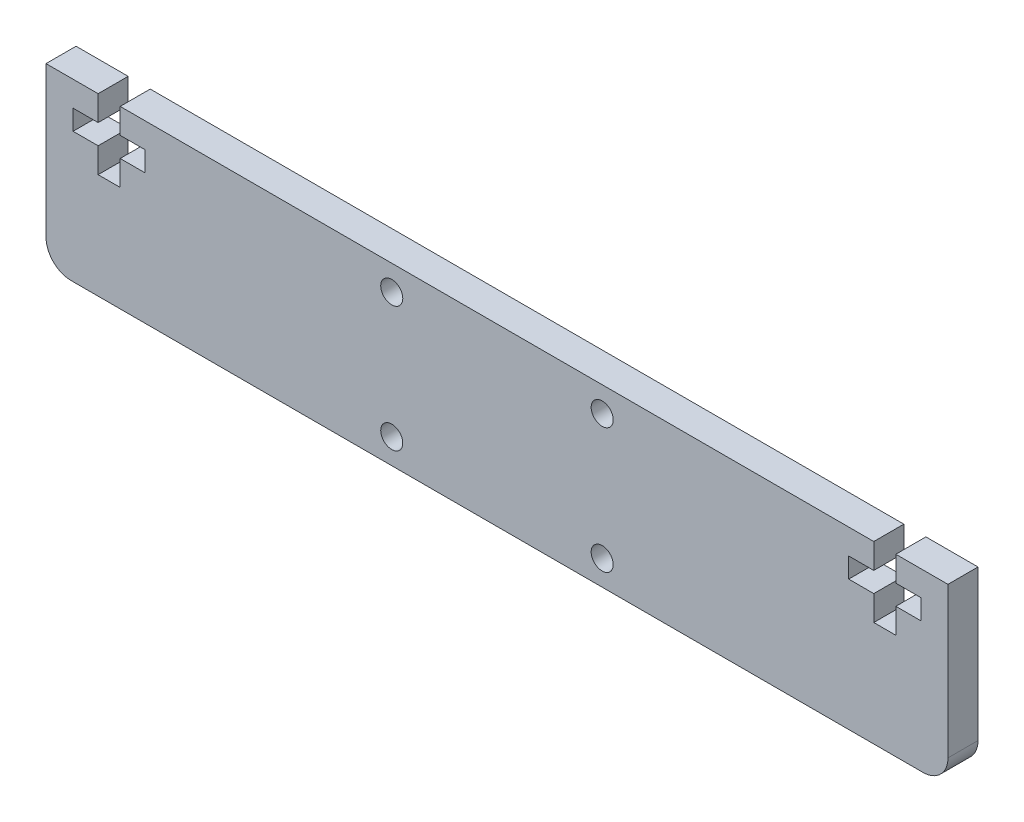
ISO-10303-21;
HEADER;
FILE_DESCRIPTION(('STEP AP214'),'2;1');
FILE_NAME('part.step','',(''),(''),'','','');
FILE_SCHEMA(('AUTOMOTIVE_DESIGN { 1 0 10303 214 1 1 1 1 }'));
ENDSEC;
DATA;
#1=APPLICATION_CONTEXT('core data for automotive mechanical design processes');
#2=APPLICATION_PROTOCOL_DEFINITION('international standard','automotive_design',2000,#1);
#3=PRODUCT_CONTEXT('',#1,'mechanical');
#4=PRODUCT('Part','Part','',(#3));
#5=PRODUCT_RELATED_PRODUCT_CATEGORY('part','',(#4));
#6=PRODUCT_DEFINITION_FORMATION('','',#4);
#7=PRODUCT_DEFINITION_CONTEXT('part definition',#1,'design');
#8=PRODUCT_DEFINITION('design','',#6,#7);
#9=PRODUCT_DEFINITION_SHAPE('','',#8);
#10=(LENGTH_UNIT() NAMED_UNIT(*) SI_UNIT(.MILLI.,.METRE.));
#11=(NAMED_UNIT(*) PLANE_ANGLE_UNIT() SI_UNIT($,.RADIAN.));
#12=(NAMED_UNIT(*) SI_UNIT($,.STERADIAN.) SOLID_ANGLE_UNIT());
#13=UNCERTAINTY_MEASURE_WITH_UNIT(LENGTH_MEASURE(1.E-05),#10,'distance_accuracy_value','');
#14=(GEOMETRIC_REPRESENTATION_CONTEXT(3) GLOBAL_UNCERTAINTY_ASSIGNED_CONTEXT((#13)) GLOBAL_UNIT_ASSIGNED_CONTEXT((#10,
#11,#12)) REPRESENTATION_CONTEXT('',''));
#15=CARTESIAN_POINT('',(0.,0.,0.));
#16=DIRECTION('',(0.,0.,1.));
#17=DIRECTION('',(1.,0.,0.));
#18=AXIS2_PLACEMENT_3D('',#15,#16,#17);
#19=CARTESIAN_POINT('',(0.,0.,3.));
#20=DIRECTION('',(0.,0.,1.));
#21=DIRECTION('',(1.,0.,0.));
#22=AXIS2_PLACEMENT_3D('',#19,#20,#21);
#23=PLANE('',#22);
#24=CARTESIAN_POINT('',(10.5,6.25,3.));
#25=DIRECTION('',(0.,0.,1.));
#26=DIRECTION('',(-1.,0.,0.));
#27=AXIS2_PLACEMENT_3D('',#24,#25,#26);
#28=CIRCLE('',#27,1.1);
#29=CARTESIAN_POINT('',(9.4,6.25,3.));
#30=VERTEX_POINT('',#29);
#31=EDGE_CURVE('E888',#30,#30,#28,.T.);
#32=ORIENTED_EDGE('',*,*,#31,.F.);
#33=EDGE_LOOP('',(#32));
#34=FACE_BOUND('',#33,.T.);
#35=CARTESIAN_POINT('',(10.5,-6.25,3.));
#36=DIRECTION('',(0.,0.,1.));
#37=DIRECTION('',(1.,0.,0.));
#38=AXIS2_PLACEMENT_3D('',#35,#36,#37);
#39=CIRCLE('',#38,1.1);
#40=CARTESIAN_POINT('',(11.6,-6.25,3.));
#41=VERTEX_POINT('',#40);
#42=EDGE_CURVE('E443',#41,#41,#39,.T.);
#43=ORIENTED_EDGE('',*,*,#42,.F.);
#44=EDGE_LOOP('',(#43));
#45=FACE_BOUND('',#44,.T.);
#46=DIRECTION('',(0.,-1.,0.));
#47=VECTOR('',#46,1.);
#48=CARTESIAN_POINT('',(-45.,-8.75,3.));
#49=LINE('',#48,#47);
#50=CARTESIAN_POINT('',(-45.,8.75,3.));
#51=VERTEX_POINT('',#50);
#52=CARTESIAN_POINT('',(-45.,-6.25,3.));
#53=VERTEX_POINT('',#52);
#54=EDGE_CURVE('E274',#51,#53,#49,.T.);
#55=ORIENTED_EDGE('',*,*,#54,.T.);
#56=CARTESIAN_POINT('',(-42.5,-6.25,3.));
#57=DIRECTION('',(0.,0.,1.));
#58=DIRECTION('',(1.,0.,0.));
#59=AXIS2_PLACEMENT_3D('',#56,#57,#58);
#60=CIRCLE('',#59,2.5);
#61=CARTESIAN_POINT('',(-42.5,-8.75,3.));
#62=VERTEX_POINT('',#61);
#63=EDGE_CURVE('E41',#53,#62,#60,.T.);
#64=ORIENTED_EDGE('',*,*,#63,.T.);
#65=DIRECTION('',(1.,0.,0.));
#66=VECTOR('',#65,1.);
#67=CARTESIAN_POINT('',(-45.,-8.75,3.));
#68=LINE('',#67,#66);
#69=CARTESIAN_POINT('',(42.5,-8.75,3.));
#70=VERTEX_POINT('',#69);
#71=EDGE_CURVE('E273',#62,#70,#68,.T.);
#72=ORIENTED_EDGE('',*,*,#71,.T.);
#73=CARTESIAN_POINT('',(42.5,-6.25,3.));
#74=DIRECTION('',(0.,0.,1.));
#75=DIRECTION('',(1.,0.,0.));
#76=AXIS2_PLACEMENT_3D('',#73,#74,#75);
#77=CIRCLE('',#76,2.5);
#78=CARTESIAN_POINT('',(45.,-6.25,3.));
#79=VERTEX_POINT('',#78);
#80=EDGE_CURVE('E48',#70,#79,#77,.T.);
#81=ORIENTED_EDGE('',*,*,#80,.T.);
#82=DIRECTION('',(0.,1.,0.));
#83=VECTOR('',#82,1.);
#84=CARTESIAN_POINT('',(45.,-8.75,3.));
#85=LINE('',#84,#83);
#86=CARTESIAN_POINT('',(45.,8.75,3.));
#87=VERTEX_POINT('',#86);
#88=EDGE_CURVE('E247',#79,#87,#85,.T.);
#89=ORIENTED_EDGE('',*,*,#88,.T.);
#90=DIRECTION('',(-1.,0.,0.));
#91=VECTOR('',#90,1.);
#92=CARTESIAN_POINT('',(39.8,8.74999999999998,3.));
#93=LINE('',#92,#91);
#94=CARTESIAN_POINT('',(39.8,8.74999999999998,3.));
#95=VERTEX_POINT('',#94);
#96=EDGE_CURVE('E243',#87,#95,#93,.T.);
#97=ORIENTED_EDGE('',*,*,#96,.T.);
#98=DIRECTION('',(0.,-1.,0.));
#99=VECTOR('',#98,1.);
#100=CARTESIAN_POINT('',(39.8,6.24999999999998,3.));
#101=LINE('',#100,#99);
#102=CARTESIAN_POINT('',(39.8,6.24999999999998,3.));
#103=VERTEX_POINT('',#102);
#104=EDGE_CURVE('E233',#95,#103,#101,.T.);
#105=ORIENTED_EDGE('',*,*,#104,.T.);
#106=DIRECTION('',(1.,0.,0.));
#107=VECTOR('',#106,1.);
#108=CARTESIAN_POINT('',(42.3,6.24999999999998,3.));
#109=LINE('',#108,#107);
#110=CARTESIAN_POINT('',(42.3,6.24999999999998,3.));
#111=VERTEX_POINT('',#110);
#112=EDGE_CURVE('E242',#103,#111,#109,.T.);
#113=ORIENTED_EDGE('',*,*,#112,.T.);
#114=DIRECTION('',(0.,-1.,0.));
#115=VECTOR('',#114,1.);
#116=CARTESIAN_POINT('',(42.3,4.24999999999998,3.));
#117=LINE('',#116,#115);
#118=CARTESIAN_POINT('',(42.3,4.24999999999998,3.));
#119=VERTEX_POINT('',#118);
#120=EDGE_CURVE('E376',#111,#119,#117,.T.);
#121=ORIENTED_EDGE('',*,*,#120,.T.);
#122=DIRECTION('',(-1.,0.,0.));
#123=VECTOR('',#122,1.);
#124=CARTESIAN_POINT('',(39.8,4.24999999999998,3.));
#125=LINE('',#124,#123);
#126=CARTESIAN_POINT('',(39.8,4.24999999999998,3.));
#127=VERTEX_POINT('',#126);
#128=EDGE_CURVE('E446',#119,#127,#125,.T.);
#129=ORIENTED_EDGE('',*,*,#128,.T.);
#130=DIRECTION('',(0.,-1.,0.));
#131=VECTOR('',#130,1.);
#132=CARTESIAN_POINT('',(39.8,1.74999999999998,3.));
#133=LINE('',#132,#131);
#134=CARTESIAN_POINT('',(39.8,1.74999999999998,3.));
#135=VERTEX_POINT('',#134);
#136=EDGE_CURVE('E450',#127,#135,#133,.T.);
#137=ORIENTED_EDGE('',*,*,#136,.T.);
#138=DIRECTION('',(-1.,0.,0.));
#139=VECTOR('',#138,1.);
#140=CARTESIAN_POINT('',(37.6,1.74999999999998,3.));
#141=LINE('',#140,#139);
#142=CARTESIAN_POINT('',(37.6,1.74999999999998,3.));
#143=VERTEX_POINT('',#142);
#144=EDGE_CURVE('E452',#135,#143,#141,.T.);
#145=ORIENTED_EDGE('',*,*,#144,.T.);
#146=DIRECTION('',(0.,1.,0.));
#147=VECTOR('',#146,1.);
#148=CARTESIAN_POINT('',(37.6,4.24999999999998,3.));
#149=LINE('',#148,#147);
#150=CARTESIAN_POINT('',(37.6,4.24999999999998,3.));
#151=VERTEX_POINT('',#150);
#152=EDGE_CURVE('E454',#143,#151,#149,.T.);
#153=ORIENTED_EDGE('',*,*,#152,.T.);
#154=DIRECTION('',(-1.,0.,0.));
#155=VECTOR('',#154,1.);
#156=CARTESIAN_POINT('',(35.1,4.24999999999998,3.));
#157=LINE('',#156,#155);
#158=CARTESIAN_POINT('',(35.1,4.24999999999998,3.));
#159=VERTEX_POINT('',#158);
#160=EDGE_CURVE('E456',#151,#159,#157,.T.);
#161=ORIENTED_EDGE('',*,*,#160,.T.);
#162=DIRECTION('',(0.,1.,0.));
#163=VECTOR('',#162,1.);
#164=CARTESIAN_POINT('',(35.1,6.24999999999998,3.));
#165=LINE('',#164,#163);
#166=CARTESIAN_POINT('',(35.1,6.24999999999998,3.));
#167=VERTEX_POINT('',#166);
#168=EDGE_CURVE('E458',#159,#167,#165,.T.);
#169=ORIENTED_EDGE('',*,*,#168,.T.);
#170=DIRECTION('',(1.,0.,0.));
#171=VECTOR('',#170,1.);
#172=CARTESIAN_POINT('',(37.6,6.24999999999998,3.));
#173=LINE('',#172,#171);
#174=CARTESIAN_POINT('',(37.6,6.24999999999998,3.));
#175=VERTEX_POINT('',#174);
#176=EDGE_CURVE('E460',#167,#175,#173,.T.);
#177=ORIENTED_EDGE('',*,*,#176,.T.);
#178=DIRECTION('',(0.,1.,0.));
#179=VECTOR('',#178,1.);
#180=CARTESIAN_POINT('',(37.6,8.74999999999998,3.));
#181=LINE('',#180,#179);
#182=CARTESIAN_POINT('',(37.6,8.74999999999998,3.));
#183=VERTEX_POINT('',#182);
#184=EDGE_CURVE('E462',#175,#183,#181,.T.);
#185=ORIENTED_EDGE('',*,*,#184,.T.);
#186=DIRECTION('',(-1.,0.,0.));
#187=VECTOR('',#186,1.);
#188=CARTESIAN_POINT('',(-37.6,8.74999999999998,3.));
#189=LINE('',#188,#187);
#190=CARTESIAN_POINT('',(-37.6,8.74999999999998,3.));
#191=VERTEX_POINT('',#190);
#192=EDGE_CURVE('E464',#183,#191,#189,.T.);
#193=ORIENTED_EDGE('',*,*,#192,.T.);
#194=DIRECTION('',(0.,-1.,0.));
#195=VECTOR('',#194,1.);
#196=CARTESIAN_POINT('',(-37.6,8.74999999999998,3.));
#197=LINE('',#196,#195);
#198=CARTESIAN_POINT('',(-37.6,6.24999999999998,3.));
#199=VERTEX_POINT('',#198);
#200=EDGE_CURVE('E466',#191,#199,#197,.T.);
#201=ORIENTED_EDGE('',*,*,#200,.T.);
#202=DIRECTION('',(1.,0.,0.));
#203=VECTOR('',#202,1.);
#204=CARTESIAN_POINT('',(-37.6,6.24999999999998,3.));
#205=LINE('',#204,#203);
#206=CARTESIAN_POINT('',(-35.1,6.24999999999998,3.));
#207=VERTEX_POINT('',#206);
#208=EDGE_CURVE('E468',#199,#207,#205,.T.);
#209=ORIENTED_EDGE('',*,*,#208,.T.);
#210=DIRECTION('',(0.,-1.,0.));
#211=VECTOR('',#210,1.);
#212=CARTESIAN_POINT('',(-35.1,6.24999999999998,3.));
#213=LINE('',#212,#211);
#214=CARTESIAN_POINT('',(-35.1,4.24999999999998,3.));
#215=VERTEX_POINT('',#214);
#216=EDGE_CURVE('E470',#207,#215,#213,.T.);
#217=ORIENTED_EDGE('',*,*,#216,.T.);
#218=DIRECTION('',(-1.,0.,0.));
#219=VECTOR('',#218,1.);
#220=CARTESIAN_POINT('',(-35.1,4.24999999999998,3.));
#221=LINE('',#220,#219);
#222=CARTESIAN_POINT('',(-37.6,4.24999999999998,3.));
#223=VERTEX_POINT('',#222);
#224=EDGE_CURVE('E472',#215,#223,#221,.T.);
#225=ORIENTED_EDGE('',*,*,#224,.T.);
#226=DIRECTION('',(0.,-1.,0.));
#227=VECTOR('',#226,1.);
#228=CARTESIAN_POINT('',(-37.6,4.24999999999998,3.));
#229=LINE('',#228,#227);
#230=CARTESIAN_POINT('',(-37.6,1.74999999999998,3.));
#231=VERTEX_POINT('',#230);
#232=EDGE_CURVE('E474',#223,#231,#229,.T.);
#233=ORIENTED_EDGE('',*,*,#232,.T.);
#234=DIRECTION('',(-1.,0.,0.));
#235=VECTOR('',#234,1.);
#236=CARTESIAN_POINT('',(-37.6,1.74999999999998,3.));
#237=LINE('',#236,#235);
#238=CARTESIAN_POINT('',(-39.8,1.74999999999998,3.));
#239=VERTEX_POINT('',#238);
#240=EDGE_CURVE('E476',#231,#239,#237,.T.);
#241=ORIENTED_EDGE('',*,*,#240,.T.);
#242=DIRECTION('',(0.,1.,0.));
#243=VECTOR('',#242,1.);
#244=CARTESIAN_POINT('',(-39.8,1.74999999999998,3.));
#245=LINE('',#244,#243);
#246=CARTESIAN_POINT('',(-39.8,4.24999999999998,3.));
#247=VERTEX_POINT('',#246);
#248=EDGE_CURVE('E478',#239,#247,#245,.T.);
#249=ORIENTED_EDGE('',*,*,#248,.T.);
#250=DIRECTION('',(-1.,0.,0.));
#251=VECTOR('',#250,1.);
#252=CARTESIAN_POINT('',(-39.8,4.24999999999998,3.));
#253=LINE('',#252,#251);
#254=CARTESIAN_POINT('',(-42.3,4.24999999999998,3.));
#255=VERTEX_POINT('',#254);
#256=EDGE_CURVE('E480',#247,#255,#253,.T.);
#257=ORIENTED_EDGE('',*,*,#256,.T.);
#258=DIRECTION('',(0.,1.,0.));
#259=VECTOR('',#258,1.);
#260=CARTESIAN_POINT('',(-42.3,4.24999999999998,3.));
#261=LINE('',#260,#259);
#262=CARTESIAN_POINT('',(-42.3,6.24999999999998,3.));
#263=VERTEX_POINT('',#262);
#264=EDGE_CURVE('E482',#255,#263,#261,.T.);
#265=ORIENTED_EDGE('',*,*,#264,.T.);
#266=DIRECTION('',(1.,0.,0.));
#267=VECTOR('',#266,1.);
#268=CARTESIAN_POINT('',(-42.3,6.24999999999998,3.));
#269=LINE('',#268,#267);
#270=CARTESIAN_POINT('',(-39.8,6.24999999999998,3.));
#271=VERTEX_POINT('',#270);
#272=EDGE_CURVE('E438',#263,#271,#269,.T.);
#273=ORIENTED_EDGE('',*,*,#272,.T.);
#274=DIRECTION('',(0.,1.,0.));
#275=VECTOR('',#274,1.);
#276=CARTESIAN_POINT('',(-39.8,6.24999999999998,3.));
#277=LINE('',#276,#275);
#278=CARTESIAN_POINT('',(-39.8,8.74999999999998,3.));
#279=VERTEX_POINT('',#278);
#280=EDGE_CURVE('E435',#271,#279,#277,.T.);
#281=ORIENTED_EDGE('',*,*,#280,.T.);
#282=DIRECTION('',(-1.,0.,0.));
#283=VECTOR('',#282,1.);
#284=CARTESIAN_POINT('',(-45.,8.75,3.));
#285=LINE('',#284,#283);
#286=EDGE_CURVE('E434',#279,#51,#285,.T.);
#287=ORIENTED_EDGE('',*,*,#286,.T.);
#288=EDGE_LOOP('',(#55,#64,#72,#81,#89,#97,#105,#113,#121,#129,#137,#145,#153,#161,#169,#177,
#185,#193,#201,#209,#217,#225,#233,#241,#249,#257,#265,#273,#281,#287));
#289=FACE_BOUND('',#288,.T.);
#290=CARTESIAN_POINT('',(-10.5,6.25,3.));
#291=DIRECTION('',(0.,0.,1.));
#292=DIRECTION('',(1.,0.,0.));
#293=AXIS2_PLACEMENT_3D('',#290,#291,#292);
#294=CIRCLE('',#293,1.1);
#295=CARTESIAN_POINT('',(-9.39999999999999,6.25,3.));
#296=VERTEX_POINT('',#295);
#297=EDGE_CURVE('E894',#296,#296,#294,.T.);
#298=ORIENTED_EDGE('',*,*,#297,.F.);
#299=EDGE_LOOP('',(#298));
#300=FACE_BOUND('',#299,.T.);
#301=CARTESIAN_POINT('',(-10.5,-6.25,3.));
#302=DIRECTION('',(0.,0.,1.));
#303=DIRECTION('',(-1.,0.,0.));
#304=AXIS2_PLACEMENT_3D('',#301,#302,#303);
#305=CIRCLE('',#304,1.1);
#306=CARTESIAN_POINT('',(-11.6,-6.25,3.));
#307=VERTEX_POINT('',#306);
#308=EDGE_CURVE('E879',#307,#307,#305,.T.);
#309=ORIENTED_EDGE('',*,*,#308,.F.);
#310=EDGE_LOOP('',(#309));
#311=FACE_BOUND('',#310,.T.);
#312=ADVANCED_FACE('F33',(#34,#45,#289,#300,#311),#23,.T.);
#313=CARTESIAN_POINT('',(0.,0.,0.));
#314=DIRECTION('',(0.,0.,1.));
#315=DIRECTION('',(1.,0.,0.));
#316=AXIS2_PLACEMENT_3D('',#313,#314,#315);
#317=PLANE('',#316);
#318=DIRECTION('',(1.,0.,0.));
#319=VECTOR('',#318,1.);
#320=CARTESIAN_POINT('',(-45.,-8.75,0.));
#321=LINE('',#320,#319);
#322=CARTESIAN_POINT('',(-42.5,-8.75,0.));
#323=VERTEX_POINT('',#322);
#324=CARTESIAN_POINT('',(42.5,-8.75,0.));
#325=VERTEX_POINT('',#324);
#326=EDGE_CURVE('E290',#323,#325,#321,.T.);
#327=ORIENTED_EDGE('',*,*,#326,.F.);
#328=CARTESIAN_POINT('',(-42.5,-6.25,0.));
#329=DIRECTION('',(0.,0.,1.));
#330=DIRECTION('',(1.,0.,0.));
#331=AXIS2_PLACEMENT_3D('',#328,#329,#330);
#332=CIRCLE('',#331,2.5);
#333=CARTESIAN_POINT('',(-45.,-6.25,0.));
#334=VERTEX_POINT('',#333);
#335=EDGE_CURVE('E268',#323,#334,#332,.F.);
#336=ORIENTED_EDGE('',*,*,#335,.T.);
#337=DIRECTION('',(0.,-1.,0.));
#338=VECTOR('',#337,1.);
#339=CARTESIAN_POINT('',(-45.,-8.75,0.));
#340=LINE('',#339,#338);
#341=CARTESIAN_POINT('',(-45.,8.75,0.));
#342=VERTEX_POINT('',#341);
#343=EDGE_CURVE('E289',#342,#334,#340,.T.);
#344=ORIENTED_EDGE('',*,*,#343,.F.);
#345=DIRECTION('',(-1.,0.,0.));
#346=VECTOR('',#345,1.);
#347=CARTESIAN_POINT('',(-45.,8.75,0.));
#348=LINE('',#347,#346);
#349=CARTESIAN_POINT('',(-39.8,8.74999999999998,0.));
#350=VERTEX_POINT('',#349);
#351=EDGE_CURVE('E295',#350,#342,#348,.T.);
#352=ORIENTED_EDGE('',*,*,#351,.F.);
#353=DIRECTION('',(0.,1.,0.));
#354=VECTOR('',#353,1.);
#355=CARTESIAN_POINT('',(-39.8,6.24999999999998,0.));
#356=LINE('',#355,#354);
#357=CARTESIAN_POINT('',(-39.8,6.24999999999998,0.));
#358=VERTEX_POINT('',#357);
#359=EDGE_CURVE('E298',#358,#350,#356,.T.);
#360=ORIENTED_EDGE('',*,*,#359,.F.);
#361=DIRECTION('',(1.,0.,0.));
#362=VECTOR('',#361,1.);
#363=CARTESIAN_POINT('',(-42.3,6.24999999999998,0.));
#364=LINE('',#363,#362);
#365=CARTESIAN_POINT('',(-42.3,6.24999999999998,0.));
#366=VERTEX_POINT('',#365);
#367=EDGE_CURVE('E423',#366,#358,#364,.T.);
#368=ORIENTED_EDGE('',*,*,#367,.F.);
#369=DIRECTION('',(0.,1.,0.));
#370=VECTOR('',#369,1.);
#371=CARTESIAN_POINT('',(-42.3,4.24999999999998,0.));
#372=LINE('',#371,#370);
#373=CARTESIAN_POINT('',(-42.3,4.24999999999998,0.));
#374=VERTEX_POINT('',#373);
#375=EDGE_CURVE('E421',#374,#366,#372,.T.);
#376=ORIENTED_EDGE('',*,*,#375,.F.);
#377=DIRECTION('',(-1.,0.,0.));
#378=VECTOR('',#377,1.);
#379=CARTESIAN_POINT('',(-39.8,4.24999999999998,0.));
#380=LINE('',#379,#378);
#381=CARTESIAN_POINT('',(-39.8,4.24999999999998,0.));
#382=VERTEX_POINT('',#381);
#383=EDGE_CURVE('E419',#382,#374,#380,.T.);
#384=ORIENTED_EDGE('',*,*,#383,.F.);
#385=DIRECTION('',(0.,1.,0.));
#386=VECTOR('',#385,1.);
#387=CARTESIAN_POINT('',(-39.8,1.74999999999998,0.));
#388=LINE('',#387,#386);
#389=CARTESIAN_POINT('',(-39.8,1.74999999999998,0.));
#390=VERTEX_POINT('',#389);
#391=EDGE_CURVE('E417',#390,#382,#388,.T.);
#392=ORIENTED_EDGE('',*,*,#391,.F.);
#393=DIRECTION('',(-1.,0.,0.));
#394=VECTOR('',#393,1.);
#395=CARTESIAN_POINT('',(-37.6,1.74999999999998,0.));
#396=LINE('',#395,#394);
#397=CARTESIAN_POINT('',(-37.6,1.74999999999998,0.));
#398=VERTEX_POINT('',#397);
#399=EDGE_CURVE('E415',#398,#390,#396,.T.);
#400=ORIENTED_EDGE('',*,*,#399,.F.);
#401=DIRECTION('',(0.,-1.,0.));
#402=VECTOR('',#401,1.);
#403=CARTESIAN_POINT('',(-37.6,4.24999999999998,0.));
#404=LINE('',#403,#402);
#405=CARTESIAN_POINT('',(-37.6,4.24999999999998,0.));
#406=VERTEX_POINT('',#405);
#407=EDGE_CURVE('E413',#406,#398,#404,.T.);
#408=ORIENTED_EDGE('',*,*,#407,.F.);
#409=DIRECTION('',(-1.,0.,0.));
#410=VECTOR('',#409,1.);
#411=CARTESIAN_POINT('',(-35.1,4.24999999999998,0.));
#412=LINE('',#411,#410);
#413=CARTESIAN_POINT('',(-35.1,4.24999999999998,0.));
#414=VERTEX_POINT('',#413);
#415=EDGE_CURVE('E411',#414,#406,#412,.T.);
#416=ORIENTED_EDGE('',*,*,#415,.F.);
#417=DIRECTION('',(0.,-1.,0.));
#418=VECTOR('',#417,1.);
#419=CARTESIAN_POINT('',(-35.1,6.24999999999998,0.));
#420=LINE('',#419,#418);
#421=CARTESIAN_POINT('',(-35.1,6.24999999999998,0.));
#422=VERTEX_POINT('',#421);
#423=EDGE_CURVE('E409',#422,#414,#420,.T.);
#424=ORIENTED_EDGE('',*,*,#423,.F.);
#425=DIRECTION('',(1.,0.,0.));
#426=VECTOR('',#425,1.);
#427=CARTESIAN_POINT('',(-37.6,6.24999999999998,0.));
#428=LINE('',#427,#426);
#429=CARTESIAN_POINT('',(-37.6,6.24999999999998,0.));
#430=VERTEX_POINT('',#429);
#431=EDGE_CURVE('E407',#430,#422,#428,.T.);
#432=ORIENTED_EDGE('',*,*,#431,.F.);
#433=DIRECTION('',(0.,-1.,0.));
#434=VECTOR('',#433,1.);
#435=CARTESIAN_POINT('',(-37.6,8.74999999999998,0.));
#436=LINE('',#435,#434);
#437=CARTESIAN_POINT('',(-37.6,8.74999999999998,0.));
#438=VERTEX_POINT('',#437);
#439=EDGE_CURVE('E405',#438,#430,#436,.T.);
#440=ORIENTED_EDGE('',*,*,#439,.F.);
#441=DIRECTION('',(-1.,0.,0.));
#442=VECTOR('',#441,1.);
#443=CARTESIAN_POINT('',(-37.6,8.74999999999998,0.));
#444=LINE('',#443,#442);
#445=CARTESIAN_POINT('',(37.6,8.74999999999998,0.));
#446=VERTEX_POINT('',#445);
#447=EDGE_CURVE('E403',#446,#438,#444,.T.);
#448=ORIENTED_EDGE('',*,*,#447,.F.);
#449=DIRECTION('',(0.,1.,0.));
#450=VECTOR('',#449,1.);
#451=CARTESIAN_POINT('',(37.6,8.74999999999998,0.));
#452=LINE('',#451,#450);
#453=CARTESIAN_POINT('',(37.6,6.24999999999998,0.));
#454=VERTEX_POINT('',#453);
#455=EDGE_CURVE('E401',#454,#446,#452,.T.);
#456=ORIENTED_EDGE('',*,*,#455,.F.);
#457=DIRECTION('',(1.,0.,0.));
#458=VECTOR('',#457,1.);
#459=CARTESIAN_POINT('',(37.6,6.24999999999998,0.));
#460=LINE('',#459,#458);
#461=CARTESIAN_POINT('',(35.1,6.24999999999998,0.));
#462=VERTEX_POINT('',#461);
#463=EDGE_CURVE('E399',#462,#454,#460,.T.);
#464=ORIENTED_EDGE('',*,*,#463,.F.);
#465=DIRECTION('',(0.,1.,0.));
#466=VECTOR('',#465,1.);
#467=CARTESIAN_POINT('',(35.1,6.24999999999998,0.));
#468=LINE('',#467,#466);
#469=CARTESIAN_POINT('',(35.1,4.24999999999998,0.));
#470=VERTEX_POINT('',#469);
#471=EDGE_CURVE('E397',#470,#462,#468,.T.);
#472=ORIENTED_EDGE('',*,*,#471,.F.);
#473=DIRECTION('',(-1.,0.,0.));
#474=VECTOR('',#473,1.);
#475=CARTESIAN_POINT('',(35.1,4.24999999999998,0.));
#476=LINE('',#475,#474);
#477=CARTESIAN_POINT('',(37.6,4.24999999999998,0.));
#478=VERTEX_POINT('',#477);
#479=EDGE_CURVE('E395',#478,#470,#476,.T.);
#480=ORIENTED_EDGE('',*,*,#479,.F.);
#481=DIRECTION('',(0.,1.,0.));
#482=VECTOR('',#481,1.);
#483=CARTESIAN_POINT('',(37.6,4.24999999999998,0.));
#484=LINE('',#483,#482);
#485=CARTESIAN_POINT('',(37.6,1.74999999999998,0.));
#486=VERTEX_POINT('',#485);
#487=EDGE_CURVE('E393',#486,#478,#484,.T.);
#488=ORIENTED_EDGE('',*,*,#487,.F.);
#489=DIRECTION('',(-1.,0.,0.));
#490=VECTOR('',#489,1.);
#491=CARTESIAN_POINT('',(37.6,1.74999999999998,0.));
#492=LINE('',#491,#490);
#493=CARTESIAN_POINT('',(39.8,1.74999999999998,0.));
#494=VERTEX_POINT('',#493);
#495=EDGE_CURVE('E391',#494,#486,#492,.T.);
#496=ORIENTED_EDGE('',*,*,#495,.F.);
#497=DIRECTION('',(0.,-1.,0.));
#498=VECTOR('',#497,1.);
#499=CARTESIAN_POINT('',(39.8,1.74999999999998,0.));
#500=LINE('',#499,#498);
#501=CARTESIAN_POINT('',(39.8,4.24999999999998,0.));
#502=VERTEX_POINT('',#501);
#503=EDGE_CURVE('E384',#502,#494,#500,.T.);
#504=ORIENTED_EDGE('',*,*,#503,.F.);
#505=DIRECTION('',(-1.,0.,0.));
#506=VECTOR('',#505,1.);
#507=CARTESIAN_POINT('',(39.8,4.24999999999998,0.));
#508=LINE('',#507,#506);
#509=CARTESIAN_POINT('',(42.3,4.24999999999998,0.));
#510=VERTEX_POINT('',#509);
#511=EDGE_CURVE('E382',#510,#502,#508,.T.);
#512=ORIENTED_EDGE('',*,*,#511,.F.);
#513=DIRECTION('',(0.,-1.,0.));
#514=VECTOR('',#513,1.);
#515=CARTESIAN_POINT('',(42.3,4.24999999999998,0.));
#516=LINE('',#515,#514);
#517=CARTESIAN_POINT('',(42.3,6.24999999999998,0.));
#518=VERTEX_POINT('',#517);
#519=EDGE_CURVE('E375',#518,#510,#516,.T.);
#520=ORIENTED_EDGE('',*,*,#519,.F.);
#521=DIRECTION('',(1.,0.,0.));
#522=VECTOR('',#521,1.);
#523=CARTESIAN_POINT('',(42.3,6.24999999999998,0.));
#524=LINE('',#523,#522);
#525=CARTESIAN_POINT('',(39.8,6.24999999999998,0.));
#526=VERTEX_POINT('',#525);
#527=EDGE_CURVE('E380',#526,#518,#524,.T.);
#528=ORIENTED_EDGE('',*,*,#527,.F.);
#529=DIRECTION('',(0.,-1.,0.));
#530=VECTOR('',#529,1.);
#531=CARTESIAN_POINT('',(39.8,6.24999999999998,0.));
#532=LINE('',#531,#530);
#533=CARTESIAN_POINT('',(39.8,8.74999999999998,0.));
#534=VERTEX_POINT('',#533);
#535=EDGE_CURVE('E386',#534,#526,#532,.T.);
#536=ORIENTED_EDGE('',*,*,#535,.F.);
#537=DIRECTION('',(-1.,0.,0.));
#538=VECTOR('',#537,1.);
#539=CARTESIAN_POINT('',(39.8,8.74999999999998,0.));
#540=LINE('',#539,#538);
#541=CARTESIAN_POINT('',(45.,8.75,0.));
#542=VERTEX_POINT('',#541);
#543=EDGE_CURVE('E255',#542,#534,#540,.T.);
#544=ORIENTED_EDGE('',*,*,#543,.F.);
#545=DIRECTION('',(0.,1.,0.));
#546=VECTOR('',#545,1.);
#547=CARTESIAN_POINT('',(45.,-8.75,0.));
#548=LINE('',#547,#546);
#549=CARTESIAN_POINT('',(45.,-6.25,0.));
#550=VERTEX_POINT('',#549);
#551=EDGE_CURVE('E251',#550,#542,#548,.T.);
#552=ORIENTED_EDGE('',*,*,#551,.F.);
#553=CARTESIAN_POINT('',(42.5,-6.25,0.));
#554=DIRECTION('',(0.,0.,1.));
#555=DIRECTION('',(1.,0.,0.));
#556=AXIS2_PLACEMENT_3D('',#553,#554,#555);
#557=CIRCLE('',#556,2.5);
#558=EDGE_CURVE('E266',#550,#325,#557,.F.);
#559=ORIENTED_EDGE('',*,*,#558,.T.);
#560=EDGE_LOOP('',(#327,#336,#344,#352,#360,#368,#376,#384,#392,#400,#408,#416,#424,#432,#440,
#448,#456,#464,#472,#480,#488,#496,#504,#512,#520,#528,#536,#544,#552,#559));
#561=FACE_BOUND('',#560,.T.);
#562=CARTESIAN_POINT('',(10.5,-6.25,0.));
#563=DIRECTION('',(0.,0.,1.));
#564=DIRECTION('',(1.,0.,0.));
#565=AXIS2_PLACEMENT_3D('',#562,#563,#564);
#566=CIRCLE('',#565,1.1);
#567=CARTESIAN_POINT('',(11.6,-6.25,0.));
#568=VERTEX_POINT('',#567);
#569=EDGE_CURVE('E897',#568,#568,#566,.T.);
#570=ORIENTED_EDGE('',*,*,#569,.T.);
#571=EDGE_LOOP('',(#570));
#572=FACE_BOUND('',#571,.T.);
#573=CARTESIAN_POINT('',(-10.5,6.25,0.));
#574=DIRECTION('',(0.,0.,1.));
#575=DIRECTION('',(1.,0.,0.));
#576=AXIS2_PLACEMENT_3D('',#573,#574,#575);
#577=CIRCLE('',#576,1.1);
#578=CARTESIAN_POINT('',(-9.39999999999999,6.25,0.));
#579=VERTEX_POINT('',#578);
#580=EDGE_CURVE('E891',#579,#579,#577,.T.);
#581=ORIENTED_EDGE('',*,*,#580,.T.);
#582=EDGE_LOOP('',(#581));
#583=FACE_BOUND('',#582,.T.);
#584=CARTESIAN_POINT('',(10.5,6.25,0.));
#585=DIRECTION('',(0.,0.,1.));
#586=DIRECTION('',(-1.,0.,0.));
#587=AXIS2_PLACEMENT_3D('',#584,#585,#586);
#588=CIRCLE('',#587,1.1);
#589=CARTESIAN_POINT('',(9.4,6.25,0.));
#590=VERTEX_POINT('',#589);
#591=EDGE_CURVE('E885',#590,#590,#588,.T.);
#592=ORIENTED_EDGE('',*,*,#591,.T.);
#593=EDGE_LOOP('',(#592));
#594=FACE_BOUND('',#593,.T.);
#595=CARTESIAN_POINT('',(-10.5,-6.25,0.));
#596=DIRECTION('',(0.,0.,1.));
#597=DIRECTION('',(-1.,0.,0.));
#598=AXIS2_PLACEMENT_3D('',#595,#596,#597);
#599=CIRCLE('',#598,1.1);
#600=CARTESIAN_POINT('',(-11.6,-6.25,0.));
#601=VERTEX_POINT('',#600);
#602=EDGE_CURVE('E882',#601,#601,#599,.T.);
#603=ORIENTED_EDGE('',*,*,#602,.T.);
#604=EDGE_LOOP('',(#603));
#605=FACE_BOUND('',#604,.T.);
#606=ADVANCED_FACE('F286',(#561,#572,#583,#594,#605),#317,.F.);
#607=CARTESIAN_POINT('',(39.8,8.74999999999998,3.));
#608=DIRECTION('',(0.,-1.,0.));
#609=DIRECTION('',(1.,0.,0.));
#610=AXIS2_PLACEMENT_3D('',#607,#608,#609);
#611=PLANE('',#610);
#612=ORIENTED_EDGE('',*,*,#543,.T.);
#613=DIRECTION('',(0.,0.,-1.));
#614=VECTOR('',#613,1.);
#615=CARTESIAN_POINT('',(39.8,8.74999999999998,3.));
#616=LINE('',#615,#614);
#617=EDGE_CURVE('E237',#95,#534,#616,.T.);
#618=ORIENTED_EDGE('',*,*,#617,.F.);
#619=ORIENTED_EDGE('',*,*,#96,.F.);
#620=DIRECTION('',(0.,0.,-1.));
#621=VECTOR('',#620,1.);
#622=CARTESIAN_POINT('',(45.,8.75,3.));
#623=LINE('',#622,#621);
#624=EDGE_CURVE('E303',#87,#542,#623,.T.);
#625=ORIENTED_EDGE('',*,*,#624,.T.);
#626=EDGE_LOOP('',(#612,#618,#619,#625));
#627=FACE_BOUND('',#626,.T.);
#628=ADVANCED_FACE('F253',(#627),#611,.F.);
#629=CARTESIAN_POINT('',(39.8,6.24999999999998,3.));
#630=DIRECTION('',(1.,0.,0.));
#631=DIRECTION('',(0.,0.,-1.));
#632=AXIS2_PLACEMENT_3D('',#629,#630,#631);
#633=PLANE('',#632);
#634=ORIENTED_EDGE('',*,*,#535,.T.);
#635=DIRECTION('',(0.,0.,-1.));
#636=VECTOR('',#635,1.);
#637=CARTESIAN_POINT('',(39.8,6.24999999999998,3.));
#638=LINE('',#637,#636);
#639=EDGE_CURVE('E240',#103,#526,#638,.T.);
#640=ORIENTED_EDGE('',*,*,#639,.F.);
#641=ORIENTED_EDGE('',*,*,#104,.F.);
#642=ORIENTED_EDGE('',*,*,#617,.T.);
#643=EDGE_LOOP('',(#634,#640,#641,#642));
#644=FACE_BOUND('',#643,.T.);
#645=ADVANCED_FACE('F235',(#644),#633,.F.);
#646=CARTESIAN_POINT('',(42.3,6.24999999999998,3.));
#647=DIRECTION('',(0.,1.,0.));
#648=DIRECTION('',(0.,0.,1.));
#649=AXIS2_PLACEMENT_3D('',#646,#647,#648);
#650=PLANE('',#649);
#651=ORIENTED_EDGE('',*,*,#527,.T.);
#652=DIRECTION('',(0.,0.,-1.));
#653=VECTOR('',#652,1.);
#654=CARTESIAN_POINT('',(42.3,6.24999999999998,3.));
#655=LINE('',#654,#653);
#656=EDGE_CURVE('E260',#111,#518,#655,.T.);
#657=ORIENTED_EDGE('',*,*,#656,.F.);
#658=ORIENTED_EDGE('',*,*,#112,.F.);
#659=ORIENTED_EDGE('',*,*,#639,.T.);
#660=EDGE_LOOP('',(#651,#657,#658,#659));
#661=FACE_BOUND('',#660,.T.);
#662=ADVANCED_FACE('F444',(#661),#650,.F.);
#663=CARTESIAN_POINT('',(42.3,4.24999999999998,3.));
#664=DIRECTION('',(1.,0.,0.));
#665=DIRECTION('',(0.,0.,-1.));
#666=AXIS2_PLACEMENT_3D('',#663,#664,#665);
#667=PLANE('',#666);
#668=ORIENTED_EDGE('',*,*,#519,.T.);
#669=DIRECTION('',(0.,0.,-1.));
#670=VECTOR('',#669,1.);
#671=CARTESIAN_POINT('',(42.3,4.24999999999998,3.));
#672=LINE('',#671,#670);
#673=EDGE_CURVE('E366',#119,#510,#672,.T.);
#674=ORIENTED_EDGE('',*,*,#673,.F.);
#675=ORIENTED_EDGE('',*,*,#120,.F.);
#676=ORIENTED_EDGE('',*,*,#656,.T.);
#677=EDGE_LOOP('',(#668,#674,#675,#676));
#678=FACE_BOUND('',#677,.T.);
#679=ADVANCED_FACE('F373',(#678),#667,.F.);
#680=CARTESIAN_POINT('',(39.8,4.24999999999998,3.));
#681=DIRECTION('',(0.,-1.,0.));
#682=DIRECTION('',(1.,0.,0.));
#683=AXIS2_PLACEMENT_3D('',#680,#681,#682);
#684=PLANE('',#683);
#685=ORIENTED_EDGE('',*,*,#511,.T.);
#686=DIRECTION('',(0.,0.,-1.));
#687=VECTOR('',#686,1.);
#688=CARTESIAN_POINT('',(39.8,4.24999999999998,3.));
#689=LINE('',#688,#687);
#690=EDGE_CURVE('E363',#127,#502,#689,.T.);
#691=ORIENTED_EDGE('',*,*,#690,.F.);
#692=ORIENTED_EDGE('',*,*,#128,.F.);
#693=ORIENTED_EDGE('',*,*,#673,.T.);
#694=EDGE_LOOP('',(#685,#691,#692,#693));
#695=FACE_BOUND('',#694,.T.);
#696=ADVANCED_FACE('F573',(#695),#684,.F.);
#697=CARTESIAN_POINT('',(39.8,1.74999999999998,3.));
#698=DIRECTION('',(1.,0.,0.));
#699=DIRECTION('',(0.,0.,-1.));
#700=AXIS2_PLACEMENT_3D('',#697,#698,#699);
#701=PLANE('',#700);
#702=ORIENTED_EDGE('',*,*,#503,.T.);
#703=DIRECTION('',(0.,0.,-1.));
#704=VECTOR('',#703,1.);
#705=CARTESIAN_POINT('',(39.8,1.74999999999998,3.));
#706=LINE('',#705,#704);
#707=EDGE_CURVE('E360',#135,#494,#706,.T.);
#708=ORIENTED_EDGE('',*,*,#707,.F.);
#709=ORIENTED_EDGE('',*,*,#136,.F.);
#710=ORIENTED_EDGE('',*,*,#690,.T.);
#711=EDGE_LOOP('',(#702,#708,#709,#710));
#712=FACE_BOUND('',#711,.T.);
#713=ADVANCED_FACE('F569',(#712),#701,.F.);
#714=CARTESIAN_POINT('',(37.6,1.74999999999998,3.));
#715=DIRECTION('',(0.,-1.,0.));
#716=DIRECTION('',(1.,0.,0.));
#717=AXIS2_PLACEMENT_3D('',#714,#715,#716);
#718=PLANE('',#717);
#719=ORIENTED_EDGE('',*,*,#495,.T.);
#720=DIRECTION('',(0.,0.,-1.));
#721=VECTOR('',#720,1.);
#722=CARTESIAN_POINT('',(37.6,1.74999999999998,3.));
#723=LINE('',#722,#721);
#724=EDGE_CURVE('E357',#143,#486,#723,.T.);
#725=ORIENTED_EDGE('',*,*,#724,.F.);
#726=ORIENTED_EDGE('',*,*,#144,.F.);
#727=ORIENTED_EDGE('',*,*,#707,.T.);
#728=EDGE_LOOP('',(#719,#725,#726,#727));
#729=FACE_BOUND('',#728,.T.);
#730=ADVANCED_FACE('F564',(#729),#718,.F.);
#731=CARTESIAN_POINT('',(37.6,4.24999999999998,3.));
#732=DIRECTION('',(-1.,0.,0.));
#733=DIRECTION('',(0.,0.,1.));
#734=AXIS2_PLACEMENT_3D('',#731,#732,#733);
#735=PLANE('',#734);
#736=ORIENTED_EDGE('',*,*,#487,.T.);
#737=DIRECTION('',(0.,0.,-1.));
#738=VECTOR('',#737,1.);
#739=CARTESIAN_POINT('',(37.6,4.24999999999998,3.));
#740=LINE('',#739,#738);
#741=EDGE_CURVE('E354',#151,#478,#740,.T.);
#742=ORIENTED_EDGE('',*,*,#741,.F.);
#743=ORIENTED_EDGE('',*,*,#152,.F.);
#744=ORIENTED_EDGE('',*,*,#724,.T.);
#745=EDGE_LOOP('',(#736,#742,#743,#744));
#746=FACE_BOUND('',#745,.T.);
#747=ADVANCED_FACE('F560',(#746),#735,.F.);
#748=CARTESIAN_POINT('',(35.1,4.24999999999998,3.));
#749=DIRECTION('',(0.,-1.,0.));
#750=DIRECTION('',(0.,0.,-1.));
#751=AXIS2_PLACEMENT_3D('',#748,#749,#750);
#752=PLANE('',#751);
#753=ORIENTED_EDGE('',*,*,#479,.T.);
#754=DIRECTION('',(0.,0.,-1.));
#755=VECTOR('',#754,1.);
#756=CARTESIAN_POINT('',(35.1,4.24999999999998,3.));
#757=LINE('',#756,#755);
#758=EDGE_CURVE('E351',#159,#470,#757,.T.);
#759=ORIENTED_EDGE('',*,*,#758,.F.);
#760=ORIENTED_EDGE('',*,*,#160,.F.);
#761=ORIENTED_EDGE('',*,*,#741,.T.);
#762=EDGE_LOOP('',(#753,#759,#760,#761));
#763=FACE_BOUND('',#762,.T.);
#764=ADVANCED_FACE('F556',(#763),#752,.F.);
#765=CARTESIAN_POINT('',(35.1,6.24999999999998,3.));
#766=DIRECTION('',(-1.,0.,0.));
#767=DIRECTION('',(0.,0.,1.));
#768=AXIS2_PLACEMENT_3D('',#765,#766,#767);
#769=PLANE('',#768);
#770=ORIENTED_EDGE('',*,*,#471,.T.);
#771=DIRECTION('',(0.,0.,-1.));
#772=VECTOR('',#771,1.);
#773=CARTESIAN_POINT('',(35.1,6.24999999999998,3.));
#774=LINE('',#773,#772);
#775=EDGE_CURVE('E348',#167,#462,#774,.T.);
#776=ORIENTED_EDGE('',*,*,#775,.F.);
#777=ORIENTED_EDGE('',*,*,#168,.F.);
#778=ORIENTED_EDGE('',*,*,#758,.T.);
#779=EDGE_LOOP('',(#770,#776,#777,#778));
#780=FACE_BOUND('',#779,.T.);
#781=ADVANCED_FACE('F551',(#780),#769,.F.);
#782=CARTESIAN_POINT('',(37.6,6.24999999999998,3.));
#783=DIRECTION('',(0.,1.,0.));
#784=DIRECTION('',(0.,0.,1.));
#785=AXIS2_PLACEMENT_3D('',#782,#783,#784);
#786=PLANE('',#785);
#787=ORIENTED_EDGE('',*,*,#463,.T.);
#788=DIRECTION('',(0.,0.,-1.));
#789=VECTOR('',#788,1.);
#790=CARTESIAN_POINT('',(37.6,6.24999999999998,3.));
#791=LINE('',#790,#789);
#792=EDGE_CURVE('E345',#175,#454,#791,.T.);
#793=ORIENTED_EDGE('',*,*,#792,.F.);
#794=ORIENTED_EDGE('',*,*,#176,.F.);
#795=ORIENTED_EDGE('',*,*,#775,.T.);
#796=EDGE_LOOP('',(#787,#793,#794,#795));
#797=FACE_BOUND('',#796,.T.);
#798=ADVANCED_FACE('F545',(#797),#786,.F.);
#799=CARTESIAN_POINT('',(37.6,8.74999999999998,3.));
#800=DIRECTION('',(-1.,0.,0.));
#801=DIRECTION('',(0.,0.,1.));
#802=AXIS2_PLACEMENT_3D('',#799,#800,#801);
#803=PLANE('',#802);
#804=ORIENTED_EDGE('',*,*,#455,.T.);
#805=DIRECTION('',(0.,0.,-1.));
#806=VECTOR('',#805,1.);
#807=CARTESIAN_POINT('',(37.6,8.74999999999998,3.));
#808=LINE('',#807,#806);
#809=EDGE_CURVE('E342',#183,#446,#808,.T.);
#810=ORIENTED_EDGE('',*,*,#809,.F.);
#811=ORIENTED_EDGE('',*,*,#184,.F.);
#812=ORIENTED_EDGE('',*,*,#792,.T.);
#813=EDGE_LOOP('',(#804,#810,#811,#812));
#814=FACE_BOUND('',#813,.T.);
#815=ADVANCED_FACE('F541',(#814),#803,.F.);
#816=CARTESIAN_POINT('',(-37.6,8.74999999999998,3.));
#817=DIRECTION('',(0.,-1.,0.));
#818=DIRECTION('',(0.,0.,-1.));
#819=AXIS2_PLACEMENT_3D('',#816,#817,#818);
#820=PLANE('',#819);
#821=ORIENTED_EDGE('',*,*,#447,.T.);
#822=DIRECTION('',(0.,0.,-1.));
#823=VECTOR('',#822,1.);
#824=CARTESIAN_POINT('',(-37.6,8.74999999999998,3.));
#825=LINE('',#824,#823);
#826=EDGE_CURVE('E339',#191,#438,#825,.T.);
#827=ORIENTED_EDGE('',*,*,#826,.F.);
#828=ORIENTED_EDGE('',*,*,#192,.F.);
#829=ORIENTED_EDGE('',*,*,#809,.T.);
#830=EDGE_LOOP('',(#821,#827,#828,#829));
#831=FACE_BOUND('',#830,.T.);
#832=ADVANCED_FACE('F536',(#831),#820,.F.);
#833=CARTESIAN_POINT('',(-37.6,8.74999999999998,3.));
#834=DIRECTION('',(1.,0.,0.));
#835=DIRECTION('',(0.,0.,-1.));
#836=AXIS2_PLACEMENT_3D('',#833,#834,#835);
#837=PLANE('',#836);
#838=ORIENTED_EDGE('',*,*,#439,.T.);
#839=DIRECTION('',(0.,0.,-1.));
#840=VECTOR('',#839,1.);
#841=CARTESIAN_POINT('',(-37.6,6.24999999999998,3.));
#842=LINE('',#841,#840);
#843=EDGE_CURVE('E336',#199,#430,#842,.T.);
#844=ORIENTED_EDGE('',*,*,#843,.F.);
#845=ORIENTED_EDGE('',*,*,#200,.F.);
#846=ORIENTED_EDGE('',*,*,#826,.T.);
#847=EDGE_LOOP('',(#838,#844,#845,#846));
#848=FACE_BOUND('',#847,.T.);
#849=ADVANCED_FACE('F530',(#848),#837,.F.);
#850=CARTESIAN_POINT('',(-37.6,6.24999999999998,3.));
#851=DIRECTION('',(0.,1.,0.));
#852=DIRECTION('',(0.,0.,1.));
#853=AXIS2_PLACEMENT_3D('',#850,#851,#852);
#854=PLANE('',#853);
#855=ORIENTED_EDGE('',*,*,#431,.T.);
#856=DIRECTION('',(0.,0.,-1.));
#857=VECTOR('',#856,1.);
#858=CARTESIAN_POINT('',(-35.1,6.24999999999998,3.));
#859=LINE('',#858,#857);
#860=EDGE_CURVE('E333',#207,#422,#859,.T.);
#861=ORIENTED_EDGE('',*,*,#860,.F.);
#862=ORIENTED_EDGE('',*,*,#208,.F.);
#863=ORIENTED_EDGE('',*,*,#843,.T.);
#864=EDGE_LOOP('',(#855,#861,#862,#863));
#865=FACE_BOUND('',#864,.T.);
#866=ADVANCED_FACE('F526',(#865),#854,.F.);
#867=CARTESIAN_POINT('',(-35.1,6.24999999999998,3.));
#868=DIRECTION('',(1.,0.,0.));
#869=DIRECTION('',(0.,0.,-1.));
#870=AXIS2_PLACEMENT_3D('',#867,#868,#869);
#871=PLANE('',#870);
#872=ORIENTED_EDGE('',*,*,#423,.T.);
#873=DIRECTION('',(0.,0.,-1.));
#874=VECTOR('',#873,1.);
#875=CARTESIAN_POINT('',(-35.1,4.24999999999998,3.));
#876=LINE('',#875,#874);
#877=EDGE_CURVE('E330',#215,#414,#876,.T.);
#878=ORIENTED_EDGE('',*,*,#877,.F.);
#879=ORIENTED_EDGE('',*,*,#216,.F.);
#880=ORIENTED_EDGE('',*,*,#860,.T.);
#881=EDGE_LOOP('',(#872,#878,#879,#880));
#882=FACE_BOUND('',#881,.T.);
#883=ADVANCED_FACE('F521',(#882),#871,.F.);
#884=CARTESIAN_POINT('',(-35.1,4.24999999999998,3.));
#885=DIRECTION('',(0.,-1.,0.));
#886=DIRECTION('',(0.,0.,-1.));
#887=AXIS2_PLACEMENT_3D('',#884,#885,#886);
#888=PLANE('',#887);
#889=ORIENTED_EDGE('',*,*,#415,.T.);
#890=DIRECTION('',(0.,0.,-1.));
#891=VECTOR('',#890,1.);
#892=CARTESIAN_POINT('',(-37.6,4.24999999999998,3.));
#893=LINE('',#892,#891);
#894=EDGE_CURVE('E327',#223,#406,#893,.T.);
#895=ORIENTED_EDGE('',*,*,#894,.F.);
#896=ORIENTED_EDGE('',*,*,#224,.F.);
#897=ORIENTED_EDGE('',*,*,#877,.T.);
#898=EDGE_LOOP('',(#889,#895,#896,#897));
#899=FACE_BOUND('',#898,.T.);
#900=ADVANCED_FACE('F515',(#899),#888,.F.);
#901=CARTESIAN_POINT('',(-37.6,4.24999999999998,3.));
#902=DIRECTION('',(1.,0.,0.));
#903=DIRECTION('',(0.,0.,-1.));
#904=AXIS2_PLACEMENT_3D('',#901,#902,#903);
#905=PLANE('',#904);
#906=ORIENTED_EDGE('',*,*,#407,.T.);
#907=DIRECTION('',(0.,0.,-1.));
#908=VECTOR('',#907,1.);
#909=CARTESIAN_POINT('',(-37.6,1.74999999999998,3.));
#910=LINE('',#909,#908);
#911=EDGE_CURVE('E324',#231,#398,#910,.T.);
#912=ORIENTED_EDGE('',*,*,#911,.F.);
#913=ORIENTED_EDGE('',*,*,#232,.F.);
#914=ORIENTED_EDGE('',*,*,#894,.T.);
#915=EDGE_LOOP('',(#906,#912,#913,#914));
#916=FACE_BOUND('',#915,.T.);
#917=ADVANCED_FACE('F511',(#916),#905,.F.);
#918=CARTESIAN_POINT('',(-37.6,1.74999999999998,3.));
#919=DIRECTION('',(0.,-1.,0.));
#920=DIRECTION('',(1.,0.,0.));
#921=AXIS2_PLACEMENT_3D('',#918,#919,#920);
#922=PLANE('',#921);
#923=ORIENTED_EDGE('',*,*,#399,.T.);
#924=DIRECTION('',(0.,0.,-1.));
#925=VECTOR('',#924,1.);
#926=CARTESIAN_POINT('',(-39.8,1.74999999999998,3.));
#927=LINE('',#926,#925);
#928=EDGE_CURVE('E321',#239,#390,#927,.T.);
#929=ORIENTED_EDGE('',*,*,#928,.F.);
#930=ORIENTED_EDGE('',*,*,#240,.F.);
#931=ORIENTED_EDGE('',*,*,#911,.T.);
#932=EDGE_LOOP('',(#923,#929,#930,#931));
#933=FACE_BOUND('',#932,.T.);
#934=ADVANCED_FACE('F506',(#933),#922,.F.);
#935=CARTESIAN_POINT('',(-39.8,1.74999999999998,3.));
#936=DIRECTION('',(-1.,0.,0.));
#937=DIRECTION('',(0.,0.,1.));
#938=AXIS2_PLACEMENT_3D('',#935,#936,#937);
#939=PLANE('',#938);
#940=ORIENTED_EDGE('',*,*,#391,.T.);
#941=DIRECTION('',(0.,0.,-1.));
#942=VECTOR('',#941,1.);
#943=CARTESIAN_POINT('',(-39.8,4.24999999999998,3.));
#944=LINE('',#943,#942);
#945=EDGE_CURVE('E318',#247,#382,#944,.T.);
#946=ORIENTED_EDGE('',*,*,#945,.F.);
#947=ORIENTED_EDGE('',*,*,#248,.F.);
#948=ORIENTED_EDGE('',*,*,#928,.T.);
#949=EDGE_LOOP('',(#940,#946,#947,#948));
#950=FACE_BOUND('',#949,.T.);
#951=ADVANCED_FACE('F500',(#950),#939,.F.);
#952=CARTESIAN_POINT('',(-39.8,4.24999999999998,3.));
#953=DIRECTION('',(0.,-1.,0.));
#954=DIRECTION('',(1.,0.,0.));
#955=AXIS2_PLACEMENT_3D('',#952,#953,#954);
#956=PLANE('',#955);
#957=ORIENTED_EDGE('',*,*,#383,.T.);
#958=DIRECTION('',(0.,0.,-1.));
#959=VECTOR('',#958,1.);
#960=CARTESIAN_POINT('',(-42.3,4.24999999999998,3.));
#961=LINE('',#960,#959);
#962=EDGE_CURVE('E315',#255,#374,#961,.T.);
#963=ORIENTED_EDGE('',*,*,#962,.F.);
#964=ORIENTED_EDGE('',*,*,#256,.F.);
#965=ORIENTED_EDGE('',*,*,#945,.T.);
#966=EDGE_LOOP('',(#957,#963,#964,#965));
#967=FACE_BOUND('',#966,.T.);
#968=ADVANCED_FACE('F496',(#967),#956,.F.);
#969=CARTESIAN_POINT('',(-42.3,4.24999999999998,3.));
#970=DIRECTION('',(-1.,0.,0.));
#971=DIRECTION('',(0.,0.,1.));
#972=AXIS2_PLACEMENT_3D('',#969,#970,#971);
#973=PLANE('',#972);
#974=ORIENTED_EDGE('',*,*,#375,.T.);
#975=DIRECTION('',(0.,0.,-1.));
#976=VECTOR('',#975,1.);
#977=CARTESIAN_POINT('',(-42.3,6.24999999999998,3.));
#978=LINE('',#977,#976);
#979=EDGE_CURVE('E312',#263,#366,#978,.T.);
#980=ORIENTED_EDGE('',*,*,#979,.F.);
#981=ORIENTED_EDGE('',*,*,#264,.F.);
#982=ORIENTED_EDGE('',*,*,#962,.T.);
#983=EDGE_LOOP('',(#974,#980,#981,#982));
#984=FACE_BOUND('',#983,.T.);
#985=ADVANCED_FACE('F492',(#984),#973,.F.);
#986=CARTESIAN_POINT('',(-42.3,6.24999999999998,3.));
#987=DIRECTION('',(0.,1.,0.));
#988=DIRECTION('',(0.,0.,1.));
#989=AXIS2_PLACEMENT_3D('',#986,#987,#988);
#990=PLANE('',#989);
#991=ORIENTED_EDGE('',*,*,#367,.T.);
#992=DIRECTION('',(0.,0.,-1.));
#993=VECTOR('',#992,1.);
#994=CARTESIAN_POINT('',(-39.8,6.24999999999998,3.));
#995=LINE('',#994,#993);
#996=EDGE_CURVE('E309',#271,#358,#995,.T.);
#997=ORIENTED_EDGE('',*,*,#996,.F.);
#998=ORIENTED_EDGE('',*,*,#272,.F.);
#999=ORIENTED_EDGE('',*,*,#979,.T.);
#1000=EDGE_LOOP('',(#991,#997,#998,#999));
#1001=FACE_BOUND('',#1000,.T.);
#1002=ADVANCED_FACE('F487',(#1001),#990,.F.);
#1003=CARTESIAN_POINT('',(-39.8,6.24999999999998,3.));
#1004=DIRECTION('',(-1.,0.,0.));
#1005=DIRECTION('',(0.,0.,1.));
#1006=AXIS2_PLACEMENT_3D('',#1003,#1004,#1005);
#1007=PLANE('',#1006);
#1008=ORIENTED_EDGE('',*,*,#359,.T.);
#1009=DIRECTION('',(0.,0.,-1.));
#1010=VECTOR('',#1009,1.);
#1011=CARTESIAN_POINT('',(-39.8,8.74999999999998,3.));
#1012=LINE('',#1011,#1010);
#1013=EDGE_CURVE('E306',#279,#350,#1012,.T.);
#1014=ORIENTED_EDGE('',*,*,#1013,.F.);
#1015=ORIENTED_EDGE('',*,*,#280,.F.);
#1016=ORIENTED_EDGE('',*,*,#996,.T.);
#1017=EDGE_LOOP('',(#1008,#1014,#1015,#1016));
#1018=FACE_BOUND('',#1017,.T.);
#1019=ADVANCED_FACE('F427',(#1018),#1007,.F.);
#1020=CARTESIAN_POINT('',(-45.,8.75,3.));
#1021=DIRECTION('',(0.,-1.,0.));
#1022=DIRECTION('',(1.,0.,0.));
#1023=AXIS2_PLACEMENT_3D('',#1020,#1021,#1022);
#1024=PLANE('',#1023);
#1025=ORIENTED_EDGE('',*,*,#351,.T.);
#1026=DIRECTION('',(0.,0.,-1.));
#1027=VECTOR('',#1026,1.);
#1028=CARTESIAN_POINT('',(-45.,8.75,3.));
#1029=LINE('',#1028,#1027);
#1030=EDGE_CURVE('E294',#51,#342,#1029,.T.);
#1031=ORIENTED_EDGE('',*,*,#1030,.F.);
#1032=ORIENTED_EDGE('',*,*,#286,.F.);
#1033=ORIENTED_EDGE('',*,*,#1013,.T.);
#1034=EDGE_LOOP('',(#1025,#1031,#1032,#1033));
#1035=FACE_BOUND('',#1034,.T.);
#1036=ADVANCED_FACE('F433',(#1035),#1024,.F.);
#1037=CARTESIAN_POINT('',(-45.,-8.75,3.));
#1038=DIRECTION('',(1.,0.,0.));
#1039=DIRECTION('',(0.,0.,-1.));
#1040=AXIS2_PLACEMENT_3D('',#1037,#1038,#1039);
#1041=PLANE('',#1040);
#1042=ORIENTED_EDGE('',*,*,#343,.T.);
#1043=DIRECTION('',(0.,0.,-1.));
#1044=VECTOR('',#1043,1.);
#1045=CARTESIAN_POINT('',(-45.,-6.25,3.));
#1046=LINE('',#1045,#1044);
#1047=EDGE_CURVE('E56',#334,#53,#1046,.F.);
#1048=ORIENTED_EDGE('',*,*,#1047,.T.);
#1049=ORIENTED_EDGE('',*,*,#54,.F.);
#1050=ORIENTED_EDGE('',*,*,#1030,.T.);
#1051=EDGE_LOOP('',(#1042,#1048,#1049,#1050));
#1052=FACE_BOUND('',#1051,.T.);
#1053=ADVANCED_FACE('F292',(#1052),#1041,.F.);
#1054=CARTESIAN_POINT('',(-45.,-8.75,3.));
#1055=DIRECTION('',(0.,1.,0.));
#1056=DIRECTION('',(0.,0.,1.));
#1057=AXIS2_PLACEMENT_3D('',#1054,#1055,#1056);
#1058=PLANE('',#1057);
#1059=ORIENTED_EDGE('',*,*,#71,.F.);
#1060=DIRECTION('',(0.,0.,-1.));
#1061=VECTOR('',#1060,1.);
#1062=CARTESIAN_POINT('',(-42.5,-8.75,3.));
#1063=LINE('',#1062,#1061);
#1064=EDGE_CURVE('E258',#62,#323,#1063,.T.);
#1065=ORIENTED_EDGE('',*,*,#1064,.T.);
#1066=ORIENTED_EDGE('',*,*,#326,.T.);
#1067=DIRECTION('',(0.,0.,-1.));
#1068=VECTOR('',#1067,1.);
#1069=CARTESIAN_POINT('',(42.5,-8.75,3.));
#1070=LINE('',#1069,#1068);
#1071=EDGE_CURVE('E256',#325,#70,#1070,.F.);
#1072=ORIENTED_EDGE('',*,*,#1071,.T.);
#1073=EDGE_LOOP('',(#1059,#1065,#1066,#1072));
#1074=FACE_BOUND('',#1073,.T.);
#1075=ADVANCED_FACE('F278',(#1074),#1058,.F.);
#1076=CARTESIAN_POINT('',(45.,-8.75,3.));
#1077=DIRECTION('',(-1.,0.,0.));
#1078=DIRECTION('',(0.,0.,1.));
#1079=AXIS2_PLACEMENT_3D('',#1076,#1077,#1078);
#1080=PLANE('',#1079);
#1081=ORIENTED_EDGE('',*,*,#88,.F.);
#1082=DIRECTION('',(0.,0.,-1.));
#1083=VECTOR('',#1082,1.);
#1084=CARTESIAN_POINT('',(45.,-6.25,3.));
#1085=LINE('',#1084,#1083);
#1086=EDGE_CURVE('E11',#79,#550,#1085,.T.);
#1087=ORIENTED_EDGE('',*,*,#1086,.T.);
#1088=ORIENTED_EDGE('',*,*,#551,.T.);
#1089=ORIENTED_EDGE('',*,*,#624,.F.);
#1090=EDGE_LOOP('',(#1081,#1087,#1088,#1089));
#1091=FACE_BOUND('',#1090,.T.);
#1092=ADVANCED_FACE('F596',(#1091),#1080,.F.);
#1093=CARTESIAN_POINT('',(10.5,-6.25,3.));
#1094=DIRECTION('',(0.,0.,-1.));
#1095=DIRECTION('',(-1.,0.,0.));
#1096=AXIS2_PLACEMENT_3D('',#1093,#1094,#1095);
#1097=CYLINDRICAL_SURFACE('',#1096,1.1);
#1098=ORIENTED_EDGE('',*,*,#42,.T.);
#1099=EDGE_LOOP('',(#1098));
#1100=FACE_BOUND('',#1099,.T.);
#1101=ORIENTED_EDGE('',*,*,#569,.F.);
#1102=EDGE_LOOP('',(#1101));
#1103=FACE_BOUND('',#1102,.T.);
#1104=ADVANCED_FACE('F593',(#1100,#1103),#1097,.F.);
#1105=CARTESIAN_POINT('',(-10.5,6.25,3.));
#1106=DIRECTION('',(0.,0.,-1.));
#1107=DIRECTION('',(-1.,0.,0.));
#1108=AXIS2_PLACEMENT_3D('',#1105,#1106,#1107);
#1109=CYLINDRICAL_SURFACE('',#1108,1.1);
#1110=ORIENTED_EDGE('',*,*,#297,.T.);
#1111=EDGE_LOOP('',(#1110));
#1112=FACE_BOUND('',#1111,.T.);
#1113=ORIENTED_EDGE('',*,*,#580,.F.);
#1114=EDGE_LOOP('',(#1113));
#1115=FACE_BOUND('',#1114,.T.);
#1116=ADVANCED_FACE('F743',(#1112,#1115),#1109,.F.);
#1117=CARTESIAN_POINT('',(10.5,6.25,3.));
#1118=DIRECTION('',(0.,0.,-1.));
#1119=DIRECTION('',(-1.,0.,0.));
#1120=AXIS2_PLACEMENT_3D('',#1117,#1118,#1119);
#1121=CYLINDRICAL_SURFACE('',#1120,1.1);
#1122=ORIENTED_EDGE('',*,*,#31,.T.);
#1123=EDGE_LOOP('',(#1122));
#1124=FACE_BOUND('',#1123,.T.);
#1125=ORIENTED_EDGE('',*,*,#591,.F.);
#1126=EDGE_LOOP('',(#1125));
#1127=FACE_BOUND('',#1126,.T.);
#1128=ADVANCED_FACE('F749',(#1124,#1127),#1121,.F.);
#1129=CARTESIAN_POINT('',(-10.5,-6.25,3.));
#1130=DIRECTION('',(0.,0.,-1.));
#1131=DIRECTION('',(-1.,0.,0.));
#1132=AXIS2_PLACEMENT_3D('',#1129,#1130,#1131);
#1133=CYLINDRICAL_SURFACE('',#1132,1.1);
#1134=ORIENTED_EDGE('',*,*,#308,.T.);
#1135=EDGE_LOOP('',(#1134));
#1136=FACE_BOUND('',#1135,.T.);
#1137=ORIENTED_EDGE('',*,*,#602,.F.);
#1138=EDGE_LOOP('',(#1137));
#1139=FACE_BOUND('',#1138,.T.);
#1140=ADVANCED_FACE('F756',(#1136,#1139),#1133,.F.);
#1141=CARTESIAN_POINT('',(-42.5,-6.25,3.));
#1142=DIRECTION('',(0.,0.,-1.));
#1143=DIRECTION('',(-1.,0.,0.));
#1144=AXIS2_PLACEMENT_3D('',#1141,#1142,#1143);
#1145=CYLINDRICAL_SURFACE('',#1144,2.5);
#1146=ORIENTED_EDGE('',*,*,#63,.F.);
#1147=ORIENTED_EDGE('',*,*,#1047,.F.);
#1148=ORIENTED_EDGE('',*,*,#335,.F.);
#1149=ORIENTED_EDGE('',*,*,#1064,.F.);
#1150=EDGE_LOOP('',(#1146,#1147,#1148,#1149));
#1151=FACE_BOUND('',#1150,.T.);
#1152=ADVANCED_FACE('F283',(#1151),#1145,.T.);
#1153=CARTESIAN_POINT('',(42.5,-6.25,3.));
#1154=DIRECTION('',(0.,0.,-1.));
#1155=DIRECTION('',(-1.,0.,0.));
#1156=AXIS2_PLACEMENT_3D('',#1153,#1154,#1155);
#1157=CYLINDRICAL_SURFACE('',#1156,2.5);
#1158=ORIENTED_EDGE('',*,*,#80,.F.);
#1159=ORIENTED_EDGE('',*,*,#1071,.F.);
#1160=ORIENTED_EDGE('',*,*,#558,.F.);
#1161=ORIENTED_EDGE('',*,*,#1086,.F.);
#1162=EDGE_LOOP('',(#1158,#1159,#1160,#1161));
#1163=FACE_BOUND('',#1162,.T.);
#1164=ADVANCED_FACE('F35',(#1163),#1157,.T.);
#1165=CLOSED_SHELL('',(#312,#606,#628,#645,#662,#679,#696,#713,#730,#747,#764,#781,#798,#815,
#832,#849,#866,#883,#900,#917,#934,#951,#968,#985,#1002,#1019,#1036,#1053,#1075,#1092,#1104,
#1116,#1128,#1140,#1152,#1164));
#1166=MANIFOLD_SOLID_BREP('B2',#1165);
#1167=ADVANCED_BREP_SHAPE_REPRESENTATION('',(#18,#1166),#14);
#1168=SHAPE_DEFINITION_REPRESENTATION(#9,#1167);
ENDSEC;
END-ISO-10303-21;
